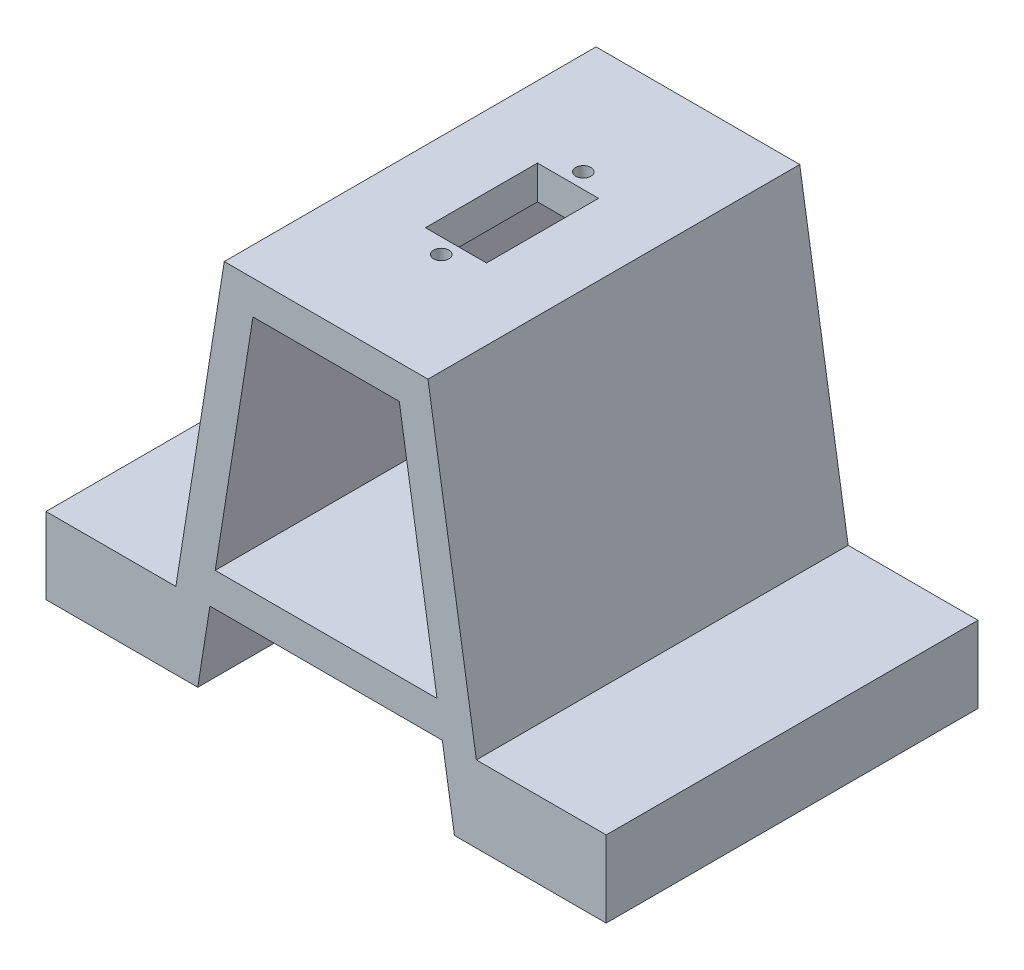
ISO-10303-21;
HEADER;
FILE_DESCRIPTION(('STEP AP214'),'2;1');
FILE_NAME('part.step','',(''),(''),'','','');
FILE_SCHEMA(('AUTOMOTIVE_DESIGN { 1 0 10303 214 1 1 1 1 }'));
ENDSEC;
DATA;
#1=APPLICATION_CONTEXT('core data for automotive mechanical design processes');
#2=APPLICATION_PROTOCOL_DEFINITION('international standard','automotive_design',2000,#1);
#3=PRODUCT_CONTEXT('',#1,'mechanical');
#4=PRODUCT('Part','Part','',(#3));
#5=PRODUCT_RELATED_PRODUCT_CATEGORY('part','',(#4));
#6=PRODUCT_DEFINITION_FORMATION('','',#4);
#7=PRODUCT_DEFINITION_CONTEXT('part definition',#1,'design');
#8=PRODUCT_DEFINITION('design','',#6,#7);
#9=PRODUCT_DEFINITION_SHAPE('','',#8);
#10=(LENGTH_UNIT() NAMED_UNIT(*) SI_UNIT(.MILLI.,.METRE.));
#11=(NAMED_UNIT(*) PLANE_ANGLE_UNIT() SI_UNIT($,.RADIAN.));
#12=(NAMED_UNIT(*) SI_UNIT($,.STERADIAN.) SOLID_ANGLE_UNIT());
#13=UNCERTAINTY_MEASURE_WITH_UNIT(LENGTH_MEASURE(1.E-05),#10,'distance_accuracy_value','');
#14=(GEOMETRIC_REPRESENTATION_CONTEXT(3) GLOBAL_UNCERTAINTY_ASSIGNED_CONTEXT((#13)) GLOBAL_UNIT_ASSIGNED_CONTEXT((#10,
#11,#12)) REPRESENTATION_CONTEXT('',''));
#15=CARTESIAN_POINT('',(0.,0.,0.));
#16=DIRECTION('',(0.,0.,1.));
#17=DIRECTION('',(1.,0.,0.));
#18=AXIS2_PLACEMENT_3D('',#15,#16,#17);
#19=CARTESIAN_POINT('',(-55.,0.,36.5));
#20=DIRECTION('',(0.,1.,0.));
#21=DIRECTION('',(0.,0.,1.));
#22=AXIS2_PLACEMENT_3D('',#19,#20,#21);
#23=PLANE('',#22);
#24=DIRECTION('',(0.,0.,1.));
#25=VECTOR('',#24,1.);
#26=CARTESIAN_POINT('',(25.1965631941392,0.,-36.5));
#27=LINE('',#26,#25);
#28=CARTESIAN_POINT('',(25.1965631941392,0.,-36.5));
#29=VERTEX_POINT('',#28);
#30=CARTESIAN_POINT('',(25.1965631941392,0.,36.5));
#31=VERTEX_POINT('',#30);
#32=EDGE_CURVE('E220',#29,#31,#27,.T.);
#33=ORIENTED_EDGE('',*,*,#32,.F.);
#34=DIRECTION('',(1.,0.,0.));
#35=VECTOR('',#34,1.);
#36=CARTESIAN_POINT('',(-55.,0.,-36.5));
#37=LINE('',#36,#35);
#38=CARTESIAN_POINT('',(55.,0.,-36.5));
#39=VERTEX_POINT('',#38);
#40=EDGE_CURVE('E289',#29,#39,#37,.T.);
#41=ORIENTED_EDGE('',*,*,#40,.T.);
#42=DIRECTION('',(0.,0.,-1.));
#43=VECTOR('',#42,1.);
#44=CARTESIAN_POINT('',(55.,0.,36.5));
#45=LINE('',#44,#43);
#46=CARTESIAN_POINT('',(55.,0.,36.5));
#47=VERTEX_POINT('',#46);
#48=EDGE_CURVE('E319',#47,#39,#45,.T.);
#49=ORIENTED_EDGE('',*,*,#48,.F.);
#50=DIRECTION('',(1.,0.,0.));
#51=VECTOR('',#50,1.);
#52=CARTESIAN_POINT('',(-55.,0.,36.5));
#53=LINE('',#52,#51);
#54=EDGE_CURVE('E268',#31,#47,#53,.T.);
#55=ORIENTED_EDGE('',*,*,#54,.F.);
#56=EDGE_LOOP('',(#33,#41,#49,#55));
#57=FACE_BOUND('',#56,.T.);
#58=ADVANCED_FACE('F39',(#57),#23,.F.);
#59=CARTESIAN_POINT('',(-55.,15.,36.5));
#60=DIRECTION('',(1.,0.,0.));
#61=DIRECTION('',(0.,0.,-1.));
#62=AXIS2_PLACEMENT_3D('',#59,#60,#61);
#63=PLANE('',#62);
#64=DIRECTION('',(0.,-1.,0.));
#65=VECTOR('',#64,1.);
#66=CARTESIAN_POINT('',(-55.,15.,-36.5));
#67=LINE('',#66,#65);
#68=CARTESIAN_POINT('',(-55.,15.,-36.5));
#69=VERTEX_POINT('',#68);
#70=CARTESIAN_POINT('',(-55.,0.,-36.5));
#71=VERTEX_POINT('',#70);
#72=EDGE_CURVE('E229',#69,#71,#67,.T.);
#73=ORIENTED_EDGE('',*,*,#72,.T.);
#74=DIRECTION('',(0.,0.,-1.));
#75=VECTOR('',#74,1.);
#76=CARTESIAN_POINT('',(-55.,0.,36.5));
#77=LINE('',#76,#75);
#78=CARTESIAN_POINT('',(-55.,0.,36.5));
#79=VERTEX_POINT('',#78);
#80=EDGE_CURVE('E323',#79,#71,#77,.T.);
#81=ORIENTED_EDGE('',*,*,#80,.F.);
#82=DIRECTION('',(0.,-1.,0.));
#83=VECTOR('',#82,1.);
#84=CARTESIAN_POINT('',(-55.,15.,36.5));
#85=LINE('',#84,#83);
#86=CARTESIAN_POINT('',(-55.,15.,36.5));
#87=VERTEX_POINT('',#86);
#88=EDGE_CURVE('E264',#87,#79,#85,.T.);
#89=ORIENTED_EDGE('',*,*,#88,.F.);
#90=DIRECTION('',(0.,0.,-1.));
#91=VECTOR('',#90,1.);
#92=CARTESIAN_POINT('',(-55.,15.,36.5));
#93=LINE('',#92,#91);
#94=EDGE_CURVE('E282',#87,#69,#93,.T.);
#95=ORIENTED_EDGE('',*,*,#94,.T.);
#96=EDGE_LOOP('',(#73,#81,#89,#95));
#97=FACE_BOUND('',#96,.T.);
#98=ADVANCED_FACE('F41',(#97),#63,.F.);
#99=CARTESIAN_POINT('',(-25.1965631941392,0.,-36.5));
#100=VERTEX_POINT('',#99);
#101=EDGE_CURVE('E288',#71,#100,#37,.T.);
#102=ORIENTED_EDGE('',*,*,#101,.T.);
#103=DIRECTION('',(0.,0.,1.));
#104=VECTOR('',#103,1.);
#105=CARTESIAN_POINT('',(-25.1965631941392,0.,-36.5));
#106=LINE('',#105,#104);
#107=CARTESIAN_POINT('',(-25.1965631941392,0.,36.5));
#108=VERTEX_POINT('',#107);
#109=EDGE_CURVE('E228',#100,#108,#106,.T.);
#110=ORIENTED_EDGE('',*,*,#109,.T.);
#111=EDGE_CURVE('E269',#79,#108,#53,.T.);
#112=ORIENTED_EDGE('',*,*,#111,.F.);
#113=ORIENTED_EDGE('',*,*,#80,.T.);
#114=EDGE_LOOP('',(#102,#110,#112,#113));
#115=FACE_BOUND('',#114,.T.);
#116=ADVANCED_FACE('F370',(#115),#23,.F.);
#117=CARTESIAN_POINT('',(55.,0.,36.5));
#118=DIRECTION('',(-1.,0.,0.));
#119=DIRECTION('',(0.,0.,1.));
#120=AXIS2_PLACEMENT_3D('',#117,#118,#119);
#121=PLANE('',#120);
#122=DIRECTION('',(0.,1.,0.));
#123=VECTOR('',#122,1.);
#124=CARTESIAN_POINT('',(55.,0.,-36.5));
#125=LINE('',#124,#123);
#126=CARTESIAN_POINT('',(55.,15.,-36.5));
#127=VERTEX_POINT('',#126);
#128=EDGE_CURVE('E295',#39,#127,#125,.T.);
#129=ORIENTED_EDGE('',*,*,#128,.T.);
#130=DIRECTION('',(0.,0.,-1.));
#131=VECTOR('',#130,1.);
#132=CARTESIAN_POINT('',(55.,15.,36.5));
#133=LINE('',#132,#131);
#134=CARTESIAN_POINT('',(55.,15.,36.5));
#135=VERTEX_POINT('',#134);
#136=EDGE_CURVE('E320',#135,#127,#133,.T.);
#137=ORIENTED_EDGE('',*,*,#136,.F.);
#138=DIRECTION('',(0.,1.,0.));
#139=VECTOR('',#138,1.);
#140=CARTESIAN_POINT('',(55.,0.,36.5));
#141=LINE('',#140,#139);
#142=EDGE_CURVE('E272',#47,#135,#141,.T.);
#143=ORIENTED_EDGE('',*,*,#142,.F.);
#144=ORIENTED_EDGE('',*,*,#48,.T.);
#145=EDGE_LOOP('',(#129,#137,#143,#144));
#146=FACE_BOUND('',#145,.T.);
#147=ADVANCED_FACE('F376',(#146),#121,.F.);
#148=CARTESIAN_POINT('',(55.,15.,36.5));
#149=DIRECTION('',(0.,-1.,0.));
#150=DIRECTION('',(0.,0.,-1.));
#151=AXIS2_PLACEMENT_3D('',#148,#149,#150);
#152=PLANE('',#151);
#153=DIRECTION('',(-1.,0.,0.));
#154=VECTOR('',#153,1.);
#155=CARTESIAN_POINT('',(55.,15.,-36.5));
#156=LINE('',#155,#154);
#157=CARTESIAN_POINT('',(29.503066419472,15.,-36.5));
#158=VERTEX_POINT('',#157);
#159=EDGE_CURVE('E294',#127,#158,#156,.T.);
#160=ORIENTED_EDGE('',*,*,#159,.T.);
#161=DIRECTION('',(0.,0.,-1.));
#162=VECTOR('',#161,1.);
#163=CARTESIAN_POINT('',(29.503066419472,15.,36.5));
#164=LINE('',#163,#162);
#165=CARTESIAN_POINT('',(29.503066419472,15.,36.5));
#166=VERTEX_POINT('',#165);
#167=EDGE_CURVE('E314',#166,#158,#164,.T.);
#168=ORIENTED_EDGE('',*,*,#167,.F.);
#169=DIRECTION('',(-1.,0.,0.));
#170=VECTOR('',#169,1.);
#171=CARTESIAN_POINT('',(55.,15.,36.5));
#172=LINE('',#171,#170);
#173=EDGE_CURVE('E274',#135,#166,#172,.T.);
#174=ORIENTED_EDGE('',*,*,#173,.F.);
#175=ORIENTED_EDGE('',*,*,#136,.T.);
#176=EDGE_LOOP('',(#160,#168,#174,#175));
#177=FACE_BOUND('',#176,.T.);
#178=ADVANCED_FACE('F362',(#177),#152,.F.);
#179=CARTESIAN_POINT('',(29.503066419472,15.,36.5));
#180=DIRECTION('',(-0.987688340595138,-0.156434465040228,0.));
#181=DIRECTION('',(0.156434465040228,-0.987688340595138,0.));
#182=AXIS2_PLACEMENT_3D('',#179,#180,#181);
#183=PLANE('',#182);
#184=DIRECTION('',(-0.156434465040228,0.987688340595138,0.));
#185=VECTOR('',#184,1.);
#186=CARTESIAN_POINT('',(29.503066419472,15.,-36.5));
#187=LINE('',#186,#185);
#188=CARTESIAN_POINT('',(20.,75.,-36.5));
#189=VERTEX_POINT('',#188);
#190=EDGE_CURVE('E298',#158,#189,#187,.T.);
#191=ORIENTED_EDGE('',*,*,#190,.T.);
#192=DIRECTION('',(0.,0.,-1.));
#193=VECTOR('',#192,1.);
#194=CARTESIAN_POINT('',(20.,75.,36.5));
#195=LINE('',#194,#193);
#196=CARTESIAN_POINT('',(20.,75.,36.5));
#197=VERTEX_POINT('',#196);
#198=EDGE_CURVE('E313',#197,#189,#195,.T.);
#199=ORIENTED_EDGE('',*,*,#198,.F.);
#200=DIRECTION('',(-0.156434465040228,0.987688340595138,0.));
#201=VECTOR('',#200,1.);
#202=CARTESIAN_POINT('',(29.503066419472,15.,36.5));
#203=LINE('',#202,#201);
#204=EDGE_CURVE('E280',#166,#197,#203,.T.);
#205=ORIENTED_EDGE('',*,*,#204,.F.);
#206=ORIENTED_EDGE('',*,*,#167,.T.);
#207=EDGE_LOOP('',(#191,#199,#205,#206));
#208=FACE_BOUND('',#207,.T.);
#209=ADVANCED_FACE('F348',(#208),#183,.F.);
#210=CARTESIAN_POINT('',(20.,75.,36.5));
#211=DIRECTION('',(0.,-1.,0.));
#212=DIRECTION('',(0.,0.,-1.));
#213=AXIS2_PLACEMENT_3D('',#210,#211,#212);
#214=PLANE('',#213);
#215=CARTESIAN_POINT('',(0.,75.,-14.));
#216=DIRECTION('',(0.,1.,0.));
#217=DIRECTION('',(0.,0.,1.));
#218=AXIS2_PLACEMENT_3D('',#215,#216,#217);
#219=CIRCLE('',#218,1.5);
#220=CARTESIAN_POINT('',(0.,75.,-12.5));
#221=VERTEX_POINT('',#220);
#222=EDGE_CURVE('E335',#221,#221,#219,.T.);
#223=ORIENTED_EDGE('',*,*,#222,.F.);
#224=EDGE_LOOP('',(#223));
#225=FACE_BOUND('',#224,.T.);
#226=CARTESIAN_POINT('',(0.102187058828447,75.,13.9996270594973));
#227=DIRECTION('',(0.,1.,0.));
#228=DIRECTION('',(0.,0.,1.));
#229=AXIS2_PLACEMENT_3D('',#226,#227,#228);
#230=CIRCLE('',#229,1.5);
#231=CARTESIAN_POINT('',(0.102187058828447,75.,15.4996270594973));
#232=VERTEX_POINT('',#231);
#233=EDGE_CURVE('E340',#232,#232,#230,.T.);
#234=ORIENTED_EDGE('',*,*,#233,.F.);
#235=EDGE_LOOP('',(#234));
#236=FACE_BOUND('',#235,.T.);
#237=DIRECTION('',(1.,0.,0.));
#238=VECTOR('',#237,1.);
#239=CARTESIAN_POINT('',(6.,75.,11.));
#240=LINE('',#239,#238);
#241=CARTESIAN_POINT('',(-6.,75.,11.));
#242=VERTEX_POINT('',#241);
#243=CARTESIAN_POINT('',(6.,75.,11.));
#244=VERTEX_POINT('',#243);
#245=EDGE_CURVE('E187',#242,#244,#240,.T.);
#246=ORIENTED_EDGE('',*,*,#245,.F.);
#247=DIRECTION('',(0.,0.,1.));
#248=VECTOR('',#247,1.);
#249=CARTESIAN_POINT('',(-6.,75.,11.));
#250=LINE('',#249,#248);
#251=CARTESIAN_POINT('',(-6.,75.,-11.));
#252=VERTEX_POINT('',#251);
#253=EDGE_CURVE('E57',#252,#242,#250,.T.);
#254=ORIENTED_EDGE('',*,*,#253,.F.);
#255=DIRECTION('',(-1.,0.,0.));
#256=VECTOR('',#255,1.);
#257=CARTESIAN_POINT('',(6.,75.,-11.));
#258=LINE('',#257,#256);
#259=CARTESIAN_POINT('',(6.,75.,-11.));
#260=VERTEX_POINT('',#259);
#261=EDGE_CURVE('E197',#260,#252,#258,.T.);
#262=ORIENTED_EDGE('',*,*,#261,.F.);
#263=DIRECTION('',(0.,0.,-1.));
#264=VECTOR('',#263,1.);
#265=CARTESIAN_POINT('',(6.,75.,11.));
#266=LINE('',#265,#264);
#267=EDGE_CURVE('E182',#244,#260,#266,.T.);
#268=ORIENTED_EDGE('',*,*,#267,.F.);
#269=EDGE_LOOP('',(#246,#254,#262,#268));
#270=FACE_BOUND('',#269,.T.);
#271=DIRECTION('',(-1.,0.,0.));
#272=VECTOR('',#271,1.);
#273=CARTESIAN_POINT('',(20.,75.,-36.5));
#274=LINE('',#273,#272);
#275=CARTESIAN_POINT('',(-20.,75.,-36.5));
#276=VERTEX_POINT('',#275);
#277=EDGE_CURVE('E296',#189,#276,#274,.T.);
#278=ORIENTED_EDGE('',*,*,#277,.T.);
#279=DIRECTION('',(0.,0.,-1.));
#280=VECTOR('',#279,1.);
#281=CARTESIAN_POINT('',(-20.,75.,36.5));
#282=LINE('',#281,#280);
#283=CARTESIAN_POINT('',(-20.,75.,36.5));
#284=VERTEX_POINT('',#283);
#285=EDGE_CURVE('E306',#284,#276,#282,.T.);
#286=ORIENTED_EDGE('',*,*,#285,.F.);
#287=DIRECTION('',(-1.,0.,0.));
#288=VECTOR('',#287,1.);
#289=CARTESIAN_POINT('',(20.,75.,36.5));
#290=LINE('',#289,#288);
#291=EDGE_CURVE('E276',#197,#284,#290,.T.);
#292=ORIENTED_EDGE('',*,*,#291,.F.);
#293=ORIENTED_EDGE('',*,*,#198,.T.);
#294=EDGE_LOOP('',(#278,#286,#292,#293));
#295=FACE_BOUND('',#294,.T.);
#296=ADVANCED_FACE('F193',(#225,#236,#270,#295),#214,.F.);
#297=CARTESIAN_POINT('',(-20.,75.,36.5));
#298=DIRECTION('',(0.987688340595138,-0.156434465040228,0.));
#299=DIRECTION('',(0.156434465040228,0.987688340595138,0.));
#300=AXIS2_PLACEMENT_3D('',#297,#298,#299);
#301=PLANE('',#300);
#302=DIRECTION('',(-0.156434465040228,-0.987688340595138,0.));
#303=VECTOR('',#302,1.);
#304=CARTESIAN_POINT('',(-20.,75.,-36.5));
#305=LINE('',#304,#303);
#306=CARTESIAN_POINT('',(-29.503066419472,15.,-36.5));
#307=VERTEX_POINT('',#306);
#308=EDGE_CURVE('E297',#276,#307,#305,.T.);
#309=ORIENTED_EDGE('',*,*,#308,.T.);
#310=DIRECTION('',(0.,0.,-1.));
#311=VECTOR('',#310,1.);
#312=CARTESIAN_POINT('',(-29.503066419472,15.,36.5));
#313=LINE('',#312,#311);
#314=CARTESIAN_POINT('',(-29.503066419472,15.,36.5));
#315=VERTEX_POINT('',#314);
#316=EDGE_CURVE('E305',#315,#307,#313,.T.);
#317=ORIENTED_EDGE('',*,*,#316,.F.);
#318=DIRECTION('',(-0.156434465040228,-0.987688340595138,0.));
#319=VECTOR('',#318,1.);
#320=CARTESIAN_POINT('',(-20.,75.,36.5));
#321=LINE('',#320,#319);
#322=EDGE_CURVE('E283',#284,#315,#321,.T.);
#323=ORIENTED_EDGE('',*,*,#322,.F.);
#324=ORIENTED_EDGE('',*,*,#285,.T.);
#325=EDGE_LOOP('',(#309,#317,#323,#324));
#326=FACE_BOUND('',#325,.T.);
#327=ADVANCED_FACE('F349',(#326),#301,.F.);
#328=CARTESIAN_POINT('',(-29.503066419472,15.,36.5));
#329=DIRECTION('',(0.,-1.,0.));
#330=DIRECTION('',(0.,0.,-1.));
#331=AXIS2_PLACEMENT_3D('',#328,#329,#330);
#332=PLANE('',#331);
#333=DIRECTION('',(-1.,0.,0.));
#334=VECTOR('',#333,1.);
#335=CARTESIAN_POINT('',(-29.503066419472,15.,-36.5));
#336=LINE('',#335,#334);
#337=EDGE_CURVE('E267',#307,#69,#336,.T.);
#338=ORIENTED_EDGE('',*,*,#337,.T.);
#339=ORIENTED_EDGE('',*,*,#94,.F.);
#340=DIRECTION('',(-1.,0.,0.));
#341=VECTOR('',#340,1.);
#342=CARTESIAN_POINT('',(-29.503066419472,15.,36.5));
#343=LINE('',#342,#341);
#344=EDGE_CURVE('E281',#315,#87,#343,.T.);
#345=ORIENTED_EDGE('',*,*,#344,.F.);
#346=ORIENTED_EDGE('',*,*,#316,.T.);
#347=EDGE_LOOP('',(#338,#339,#345,#346));
#348=FACE_BOUND('',#347,.T.);
#349=ADVANCED_FACE('F359',(#348),#332,.F.);
#350=CARTESIAN_POINT('',(0.,0.,36.5));
#351=DIRECTION('',(0.,0.,1.));
#352=DIRECTION('',(1.,0.,0.));
#353=AXIS2_PLACEMENT_3D('',#350,#351,#352);
#354=PLANE('',#353);
#355=DIRECTION('',(-0.156434465040228,0.987688340595138,0.));
#356=VECTOR('',#355,1.);
#357=CARTESIAN_POINT('',(25.1965631941392,0.,36.5));
#358=LINE('',#357,#356);
#359=CARTESIAN_POINT('',(22.8207965892712,15.,36.5));
#360=VERTEX_POINT('',#359);
#361=EDGE_CURVE('E217',#31,#360,#358,.T.);
#362=ORIENTED_EDGE('',*,*,#361,.F.);
#363=ORIENTED_EDGE('',*,*,#54,.T.);
#364=ORIENTED_EDGE('',*,*,#142,.T.);
#365=ORIENTED_EDGE('',*,*,#173,.T.);
#366=ORIENTED_EDGE('',*,*,#204,.T.);
#367=ORIENTED_EDGE('',*,*,#291,.T.);
#368=ORIENTED_EDGE('',*,*,#322,.T.);
#369=ORIENTED_EDGE('',*,*,#344,.T.);
#370=ORIENTED_EDGE('',*,*,#88,.T.);
#371=ORIENTED_EDGE('',*,*,#111,.T.);
#372=DIRECTION('',(-0.156434465040228,-0.987688340595138,0.));
#373=VECTOR('',#372,1.);
#374=CARTESIAN_POINT('',(-22.8207965892712,15.,36.5));
#375=LINE('',#374,#373);
#376=CARTESIAN_POINT('',(-22.8207965892712,15.,36.5));
#377=VERTEX_POINT('',#376);
#378=EDGE_CURVE('E211',#377,#108,#375,.T.);
#379=ORIENTED_EDGE('',*,*,#378,.F.);
#380=DIRECTION('',(-1.,0.,0.));
#381=VECTOR('',#380,1.);
#382=CARTESIAN_POINT('',(-22.8207965892712,15.,36.5));
#383=LINE('',#382,#381);
#384=EDGE_CURVE('E222',#360,#377,#383,.T.);
#385=ORIENTED_EDGE('',*,*,#384,.F.);
#386=EDGE_LOOP('',(#362,#363,#364,#365,#366,#367,#368,#369,#370,#371,#379,#385));
#387=FACE_BOUND('',#386,.T.);
#388=DIRECTION('',(-0.156434465040228,-0.987688340595138,0.));
#389=VECTOR('',#388,1.);
#390=CARTESIAN_POINT('',(-14.3630674759411,68.4,36.5));
#391=LINE('',#390,#389);
#392=CARTESIAN_POINT('',(-14.3630674759411,68.4,36.5));
#393=VERTEX_POINT('',#392);
#394=CARTESIAN_POINT('',(-21.7754592831293,21.6,36.5));
#395=VERTEX_POINT('',#394);
#396=EDGE_CURVE('E225',#393,#395,#391,.T.);
#397=ORIENTED_EDGE('',*,*,#396,.F.);
#398=DIRECTION('',(-1.,0.,0.));
#399=VECTOR('',#398,1.);
#400=CARTESIAN_POINT('',(14.3630674759411,68.4,36.5));
#401=LINE('',#400,#399);
#402=CARTESIAN_POINT('',(14.3630674759411,68.4,36.5));
#403=VERTEX_POINT('',#402);
#404=EDGE_CURVE('E244',#403,#393,#401,.T.);
#405=ORIENTED_EDGE('',*,*,#404,.F.);
#406=DIRECTION('',(-0.156434465040228,0.987688340595138,0.));
#407=VECTOR('',#406,1.);
#408=CARTESIAN_POINT('',(21.7754592831292,21.6,36.5));
#409=LINE('',#408,#407);
#410=CARTESIAN_POINT('',(21.7754592831292,21.6,36.5));
#411=VERTEX_POINT('',#410);
#412=EDGE_CURVE('E247',#411,#403,#409,.T.);
#413=ORIENTED_EDGE('',*,*,#412,.F.);
#414=DIRECTION('',(1.,0.,0.));
#415=VECTOR('',#414,1.);
#416=CARTESIAN_POINT('',(-21.7754592831293,21.6,36.5));
#417=LINE('',#416,#415);
#418=EDGE_CURVE('E253',#395,#411,#417,.T.);
#419=ORIENTED_EDGE('',*,*,#418,.F.);
#420=EDGE_LOOP('',(#397,#405,#413,#419));
#421=FACE_BOUND('',#420,.T.);
#422=ADVANCED_FACE('F399',(#387,#421),#354,.T.);
#423=CARTESIAN_POINT('',(0.,0.,-36.5));
#424=DIRECTION('',(0.,0.,1.));
#425=DIRECTION('',(1.,0.,0.));
#426=AXIS2_PLACEMENT_3D('',#423,#424,#425);
#427=PLANE('',#426);
#428=DIRECTION('',(-1.,0.,0.));
#429=VECTOR('',#428,1.);
#430=CARTESIAN_POINT('',(14.3630674759411,68.4,-36.5));
#431=LINE('',#430,#429);
#432=CARTESIAN_POINT('',(14.3630674759411,68.4,-36.5));
#433=VERTEX_POINT('',#432);
#434=CARTESIAN_POINT('',(-14.3630674759411,68.4,-36.5));
#435=VERTEX_POINT('',#434);
#436=EDGE_CURVE('E236',#433,#435,#431,.T.);
#437=ORIENTED_EDGE('',*,*,#436,.T.);
#438=DIRECTION('',(-0.156434465040228,-0.987688340595138,0.));
#439=VECTOR('',#438,1.);
#440=CARTESIAN_POINT('',(-14.3630674759411,68.4,-36.5));
#441=LINE('',#440,#439);
#442=CARTESIAN_POINT('',(-21.7754592831293,21.6,-36.5));
#443=VERTEX_POINT('',#442);
#444=EDGE_CURVE('E249',#435,#443,#441,.T.);
#445=ORIENTED_EDGE('',*,*,#444,.T.);
#446=DIRECTION('',(1.,0.,0.));
#447=VECTOR('',#446,1.);
#448=CARTESIAN_POINT('',(-21.7754592831293,21.6,-36.5));
#449=LINE('',#448,#447);
#450=CARTESIAN_POINT('',(21.7754592831292,21.6,-36.5));
#451=VERTEX_POINT('',#450);
#452=EDGE_CURVE('E257',#443,#451,#449,.T.);
#453=ORIENTED_EDGE('',*,*,#452,.T.);
#454=DIRECTION('',(-0.156434465040228,0.987688340595138,0.));
#455=VECTOR('',#454,1.);
#456=CARTESIAN_POINT('',(21.7754592831292,21.6,-36.5));
#457=LINE('',#456,#455);
#458=EDGE_CURVE('E260',#451,#433,#457,.T.);
#459=ORIENTED_EDGE('',*,*,#458,.T.);
#460=EDGE_LOOP('',(#437,#445,#453,#459));
#461=FACE_BOUND('',#460,.T.);
#462=DIRECTION('',(-1.,0.,0.));
#463=VECTOR('',#462,1.);
#464=CARTESIAN_POINT('',(-22.8207965892712,15.,-36.5));
#465=LINE('',#464,#463);
#466=CARTESIAN_POINT('',(22.8207965892712,15.,-36.5));
#467=VERTEX_POINT('',#466);
#468=CARTESIAN_POINT('',(-22.8207965892712,15.,-36.5));
#469=VERTEX_POINT('',#468);
#470=EDGE_CURVE('E209',#467,#469,#465,.T.);
#471=ORIENTED_EDGE('',*,*,#470,.T.);
#472=DIRECTION('',(-0.156434465040228,-0.987688340595138,0.));
#473=VECTOR('',#472,1.);
#474=CARTESIAN_POINT('',(-22.8207965892712,15.,-36.5));
#475=LINE('',#474,#473);
#476=EDGE_CURVE('E212',#469,#100,#475,.T.);
#477=ORIENTED_EDGE('',*,*,#476,.T.);
#478=ORIENTED_EDGE('',*,*,#101,.F.);
#479=ORIENTED_EDGE('',*,*,#72,.F.);
#480=ORIENTED_EDGE('',*,*,#337,.F.);
#481=ORIENTED_EDGE('',*,*,#308,.F.);
#482=ORIENTED_EDGE('',*,*,#277,.F.);
#483=ORIENTED_EDGE('',*,*,#190,.F.);
#484=ORIENTED_EDGE('',*,*,#159,.F.);
#485=ORIENTED_EDGE('',*,*,#128,.F.);
#486=ORIENTED_EDGE('',*,*,#40,.F.);
#487=DIRECTION('',(-0.156434465040228,0.987688340595138,0.));
#488=VECTOR('',#487,1.);
#489=CARTESIAN_POINT('',(25.1965631941392,0.,-36.5));
#490=LINE('',#489,#488);
#491=EDGE_CURVE('E210',#29,#467,#490,.T.);
#492=ORIENTED_EDGE('',*,*,#491,.T.);
#493=EDGE_LOOP('',(#471,#477,#478,#479,#480,#481,#482,#483,#484,#485,#486,#492));
#494=FACE_BOUND('',#493,.T.);
#495=ADVANCED_FACE('F387',(#461,#494),#427,.F.);
#496=CARTESIAN_POINT('',(-14.3630674759411,68.4,-36.5));
#497=DIRECTION('',(-0.987688340595138,0.156434465040228,0.));
#498=DIRECTION('',(-0.156434465040228,-0.987688340595138,0.));
#499=AXIS2_PLACEMENT_3D('',#496,#497,#498);
#500=PLANE('',#499);
#501=ORIENTED_EDGE('',*,*,#396,.T.);
#502=DIRECTION('',(0.,0.,1.));
#503=VECTOR('',#502,1.);
#504=CARTESIAN_POINT('',(-21.7754592831293,21.6,-36.5));
#505=LINE('',#504,#503);
#506=EDGE_CURVE('E235',#443,#395,#505,.T.);
#507=ORIENTED_EDGE('',*,*,#506,.F.);
#508=ORIENTED_EDGE('',*,*,#444,.F.);
#509=DIRECTION('',(0.,0.,1.));
#510=VECTOR('',#509,1.);
#511=CARTESIAN_POINT('',(-14.3630674759411,68.4,-36.5));
#512=LINE('',#511,#510);
#513=EDGE_CURVE('E204',#435,#393,#512,.T.);
#514=ORIENTED_EDGE('',*,*,#513,.T.);
#515=EDGE_LOOP('',(#501,#507,#508,#514));
#516=FACE_BOUND('',#515,.T.);
#517=ADVANCED_FACE('F440',(#516),#500,.F.);
#518=CARTESIAN_POINT('',(14.3630674759411,68.4,-36.5));
#519=DIRECTION('',(0.,1.,0.));
#520=DIRECTION('',(0.,0.,1.));
#521=AXIS2_PLACEMENT_3D('',#518,#519,#520);
#522=PLANE('',#521);
#523=CARTESIAN_POINT('',(0.,68.4,-14.));
#524=DIRECTION('',(0.,1.,0.));
#525=DIRECTION('',(0.,0.,1.));
#526=AXIS2_PLACEMENT_3D('',#523,#524,#525);
#527=CIRCLE('',#526,1.5);
#528=CARTESIAN_POINT('',(0.,68.4,-12.5));
#529=VERTEX_POINT('',#528);
#530=EDGE_CURVE('E43',#529,#529,#527,.T.);
#531=ORIENTED_EDGE('',*,*,#530,.T.);
#532=EDGE_LOOP('',(#531));
#533=FACE_BOUND('',#532,.T.);
#534=CARTESIAN_POINT('',(0.102187058828447,68.4,13.9996270594973));
#535=DIRECTION('',(0.,1.,0.));
#536=DIRECTION('',(0.,0.,1.));
#537=AXIS2_PLACEMENT_3D('',#534,#535,#536);
#538=CIRCLE('',#537,1.5);
#539=CARTESIAN_POINT('',(0.102187058828447,68.4,15.4996270594973));
#540=VERTEX_POINT('',#539);
#541=EDGE_CURVE('E329',#540,#540,#538,.T.);
#542=ORIENTED_EDGE('',*,*,#541,.T.);
#543=EDGE_LOOP('',(#542));
#544=FACE_BOUND('',#543,.T.);
#545=DIRECTION('',(-1.,0.,0.));
#546=VECTOR('',#545,1.);
#547=CARTESIAN_POINT('',(14.3630674759411,68.4,-11.));
#548=LINE('',#547,#546);
#549=CARTESIAN_POINT('',(6.,68.4,-11.));
#550=VERTEX_POINT('',#549);
#551=CARTESIAN_POINT('',(-6.,68.4,-11.));
#552=VERTEX_POINT('',#551);
#553=EDGE_CURVE('E48',#550,#552,#548,.T.);
#554=ORIENTED_EDGE('',*,*,#553,.T.);
#555=DIRECTION('',(0.,0.,1.));
#556=VECTOR('',#555,1.);
#557=CARTESIAN_POINT('',(-6.,68.4,-36.5));
#558=LINE('',#557,#556);
#559=CARTESIAN_POINT('',(-6.,68.4,11.));
#560=VERTEX_POINT('',#559);
#561=EDGE_CURVE('E11',#552,#560,#558,.T.);
#562=ORIENTED_EDGE('',*,*,#561,.T.);
#563=DIRECTION('',(1.,0.,0.));
#564=VECTOR('',#563,1.);
#565=CARTESIAN_POINT('',(14.3630674759411,68.4,11.));
#566=LINE('',#565,#564);
#567=CARTESIAN_POINT('',(6.,68.4,11.));
#568=VERTEX_POINT('',#567);
#569=EDGE_CURVE('E326',#560,#568,#566,.T.);
#570=ORIENTED_EDGE('',*,*,#569,.T.);
#571=DIRECTION('',(0.,0.,-1.));
#572=VECTOR('',#571,1.);
#573=CARTESIAN_POINT('',(6.,68.4,-36.5));
#574=LINE('',#573,#572);
#575=EDGE_CURVE('E184',#568,#550,#574,.T.);
#576=ORIENTED_EDGE('',*,*,#575,.T.);
#577=EDGE_LOOP('',(#554,#562,#570,#576));
#578=FACE_BOUND('',#577,.T.);
#579=ORIENTED_EDGE('',*,*,#404,.T.);
#580=ORIENTED_EDGE('',*,*,#513,.F.);
#581=ORIENTED_EDGE('',*,*,#436,.F.);
#582=DIRECTION('',(0.,0.,1.));
#583=VECTOR('',#582,1.);
#584=CARTESIAN_POINT('',(14.3630674759411,68.4,-36.5));
#585=LINE('',#584,#583);
#586=EDGE_CURVE('E243',#433,#403,#585,.T.);
#587=ORIENTED_EDGE('',*,*,#586,.T.);
#588=EDGE_LOOP('',(#579,#580,#581,#587));
#589=FACE_BOUND('',#588,.T.);
#590=ADVANCED_FACE('F439',(#533,#544,#578,#589),#522,.F.);
#591=CARTESIAN_POINT('',(21.7754592831292,21.6,-36.5));
#592=DIRECTION('',(0.987688340595138,0.156434465040228,0.));
#593=DIRECTION('',(-0.156434465040228,0.987688340595138,0.));
#594=AXIS2_PLACEMENT_3D('',#591,#592,#593);
#595=PLANE('',#594);
#596=ORIENTED_EDGE('',*,*,#412,.T.);
#597=ORIENTED_EDGE('',*,*,#586,.F.);
#598=ORIENTED_EDGE('',*,*,#458,.F.);
#599=DIRECTION('',(0.,0.,1.));
#600=VECTOR('',#599,1.);
#601=CARTESIAN_POINT('',(21.7754592831292,21.6,-36.5));
#602=LINE('',#601,#600);
#603=EDGE_CURVE('E239',#451,#411,#602,.T.);
#604=ORIENTED_EDGE('',*,*,#603,.T.);
#605=EDGE_LOOP('',(#596,#597,#598,#604));
#606=FACE_BOUND('',#605,.T.);
#607=ADVANCED_FACE('F443',(#606),#595,.F.);
#608=CARTESIAN_POINT('',(-21.7754592831293,21.6,-36.5));
#609=DIRECTION('',(0.,-1.,0.));
#610=DIRECTION('',(0.,0.,-1.));
#611=AXIS2_PLACEMENT_3D('',#608,#609,#610);
#612=PLANE('',#611);
#613=ORIENTED_EDGE('',*,*,#418,.T.);
#614=ORIENTED_EDGE('',*,*,#603,.F.);
#615=ORIENTED_EDGE('',*,*,#452,.F.);
#616=ORIENTED_EDGE('',*,*,#506,.T.);
#617=EDGE_LOOP('',(#613,#614,#615,#616));
#618=FACE_BOUND('',#617,.T.);
#619=ADVANCED_FACE('F445',(#618),#612,.F.);
#620=CARTESIAN_POINT('',(-22.8207965892712,15.,-36.5));
#621=DIRECTION('',(-0.987688340595138,0.156434465040228,0.));
#622=DIRECTION('',(-0.156434465040228,-0.987688340595138,0.));
#623=AXIS2_PLACEMENT_3D('',#620,#621,#622);
#624=PLANE('',#623);
#625=ORIENTED_EDGE('',*,*,#378,.T.);
#626=ORIENTED_EDGE('',*,*,#109,.F.);
#627=ORIENTED_EDGE('',*,*,#476,.F.);
#628=DIRECTION('',(0.,0.,1.));
#629=VECTOR('',#628,1.);
#630=CARTESIAN_POINT('',(-22.8207965892712,15.,-36.5));
#631=LINE('',#630,#629);
#632=EDGE_CURVE('E227',#469,#377,#631,.T.);
#633=ORIENTED_EDGE('',*,*,#632,.T.);
#634=EDGE_LOOP('',(#625,#626,#627,#633));
#635=FACE_BOUND('',#634,.T.);
#636=ADVANCED_FACE('F393',(#635),#624,.F.);
#637=CARTESIAN_POINT('',(-22.8207965892712,15.,-36.5));
#638=DIRECTION('',(0.,1.,0.));
#639=DIRECTION('',(0.,0.,1.));
#640=AXIS2_PLACEMENT_3D('',#637,#638,#639);
#641=PLANE('',#640);
#642=ORIENTED_EDGE('',*,*,#384,.T.);
#643=ORIENTED_EDGE('',*,*,#632,.F.);
#644=ORIENTED_EDGE('',*,*,#470,.F.);
#645=DIRECTION('',(0.,0.,1.));
#646=VECTOR('',#645,1.);
#647=CARTESIAN_POINT('',(22.8207965892712,15.,-36.5));
#648=LINE('',#647,#646);
#649=EDGE_CURVE('E232',#467,#360,#648,.T.);
#650=ORIENTED_EDGE('',*,*,#649,.T.);
#651=EDGE_LOOP('',(#642,#643,#644,#650));
#652=FACE_BOUND('',#651,.T.);
#653=ADVANCED_FACE('F391',(#652),#641,.F.);
#654=CARTESIAN_POINT('',(25.1965631941392,0.,-36.5));
#655=DIRECTION('',(0.987688340595138,0.156434465040228,0.));
#656=DIRECTION('',(-0.156434465040228,0.987688340595138,0.));
#657=AXIS2_PLACEMENT_3D('',#654,#655,#656);
#658=PLANE('',#657);
#659=ORIENTED_EDGE('',*,*,#361,.T.);
#660=ORIENTED_EDGE('',*,*,#649,.F.);
#661=ORIENTED_EDGE('',*,*,#491,.F.);
#662=ORIENTED_EDGE('',*,*,#32,.T.);
#663=EDGE_LOOP('',(#659,#660,#661,#662));
#664=FACE_BOUND('',#663,.T.);
#665=ADVANCED_FACE('F424',(#664),#658,.F.);
#666=CARTESIAN_POINT('',(-6.,68.,11.));
#667=DIRECTION('',(-1.,0.,0.));
#668=DIRECTION('',(0.,0.,1.));
#669=AXIS2_PLACEMENT_3D('',#666,#667,#668);
#670=PLANE('',#669);
#671=DIRECTION('',(0.,1.,0.));
#672=VECTOR('',#671,1.);
#673=CARTESIAN_POINT('',(-6.,68.,-11.));
#674=LINE('',#673,#672);
#675=EDGE_CURVE('E205',#552,#252,#674,.T.);
#676=ORIENTED_EDGE('',*,*,#675,.T.);
#677=ORIENTED_EDGE('',*,*,#253,.T.);
#678=DIRECTION('',(0.,1.,0.));
#679=VECTOR('',#678,1.);
#680=CARTESIAN_POINT('',(-6.,68.,11.));
#681=LINE('',#680,#679);
#682=EDGE_CURVE('E190',#560,#242,#681,.T.);
#683=ORIENTED_EDGE('',*,*,#682,.F.);
#684=ORIENTED_EDGE('',*,*,#561,.F.);
#685=EDGE_LOOP('',(#676,#677,#683,#684));
#686=FACE_BOUND('',#685,.T.);
#687=ADVANCED_FACE('F426',(#686),#670,.F.);
#688=CARTESIAN_POINT('',(6.,68.,-11.));
#689=DIRECTION('',(0.,0.,-1.));
#690=DIRECTION('',(-1.,0.,0.));
#691=AXIS2_PLACEMENT_3D('',#688,#689,#690);
#692=PLANE('',#691);
#693=DIRECTION('',(0.,1.,0.));
#694=VECTOR('',#693,1.);
#695=CARTESIAN_POINT('',(6.,68.,-11.));
#696=LINE('',#695,#694);
#697=EDGE_CURVE('E188',#550,#260,#696,.T.);
#698=ORIENTED_EDGE('',*,*,#697,.T.);
#699=ORIENTED_EDGE('',*,*,#261,.T.);
#700=ORIENTED_EDGE('',*,*,#675,.F.);
#701=ORIENTED_EDGE('',*,*,#553,.F.);
#702=EDGE_LOOP('',(#698,#699,#700,#701));
#703=FACE_BOUND('',#702,.T.);
#704=ADVANCED_FACE('F435',(#703),#692,.F.);
#705=CARTESIAN_POINT('',(6.,68.,11.));
#706=DIRECTION('',(1.,0.,0.));
#707=DIRECTION('',(0.,0.,-1.));
#708=AXIS2_PLACEMENT_3D('',#705,#706,#707);
#709=PLANE('',#708);
#710=DIRECTION('',(0.,1.,0.));
#711=VECTOR('',#710,1.);
#712=CARTESIAN_POINT('',(6.,68.,11.));
#713=LINE('',#712,#711);
#714=EDGE_CURVE('E64',#568,#244,#713,.T.);
#715=ORIENTED_EDGE('',*,*,#714,.T.);
#716=ORIENTED_EDGE('',*,*,#267,.T.);
#717=ORIENTED_EDGE('',*,*,#697,.F.);
#718=ORIENTED_EDGE('',*,*,#575,.F.);
#719=EDGE_LOOP('',(#715,#716,#717,#718));
#720=FACE_BOUND('',#719,.T.);
#721=ADVANCED_FACE('F179',(#720),#709,.F.);
#722=CARTESIAN_POINT('',(6.,68.,11.));
#723=DIRECTION('',(0.,0.,1.));
#724=DIRECTION('',(1.,0.,0.));
#725=AXIS2_PLACEMENT_3D('',#722,#723,#724);
#726=PLANE('',#725);
#727=ORIENTED_EDGE('',*,*,#682,.T.);
#728=ORIENTED_EDGE('',*,*,#245,.T.);
#729=ORIENTED_EDGE('',*,*,#714,.F.);
#730=ORIENTED_EDGE('',*,*,#569,.F.);
#731=EDGE_LOOP('',(#727,#728,#729,#730));
#732=FACE_BOUND('',#731,.T.);
#733=ADVANCED_FACE('F191',(#732),#726,.F.);
#734=CARTESIAN_POINT('',(0.102187058828447,67.,13.9996270594973));
#735=DIRECTION('',(0.,1.,0.));
#736=DIRECTION('',(0.,0.,1.));
#737=AXIS2_PLACEMENT_3D('',#734,#735,#736);
#738=CYLINDRICAL_SURFACE('',#737,1.5);
#739=ORIENTED_EDGE('',*,*,#233,.T.);
#740=EDGE_LOOP('',(#739));
#741=FACE_BOUND('',#740,.T.);
#742=ORIENTED_EDGE('',*,*,#541,.F.);
#743=EDGE_LOOP('',(#742));
#744=FACE_BOUND('',#743,.T.);
#745=ADVANCED_FACE('F345',(#741,#744),#738,.F.);
#746=CARTESIAN_POINT('',(0.,67.,-14.));
#747=DIRECTION('',(0.,1.,0.));
#748=DIRECTION('',(0.,0.,1.));
#749=AXIS2_PLACEMENT_3D('',#746,#747,#748);
#750=CYLINDRICAL_SURFACE('',#749,1.5);
#751=ORIENTED_EDGE('',*,*,#222,.T.);
#752=EDGE_LOOP('',(#751));
#753=FACE_BOUND('',#752,.T.);
#754=ORIENTED_EDGE('',*,*,#530,.F.);
#755=EDGE_LOOP('',(#754));
#756=FACE_BOUND('',#755,.T.);
#757=ADVANCED_FACE('F582',(#753,#756),#750,.F.);
#758=CLOSED_SHELL('',(#58,#98,#116,#147,#178,#209,#296,#327,#349,#422,#495,#517,#590,#607,#619,
#636,#653,#665,#687,#704,#721,#733,#745,#757));
#759=MANIFOLD_SOLID_BREP('B2',#758);
#760=ADVANCED_BREP_SHAPE_REPRESENTATION('',(#18,#759),#14);
#761=SHAPE_DEFINITION_REPRESENTATION(#9,#760);
ENDSEC;
END-ISO-10303-21;
